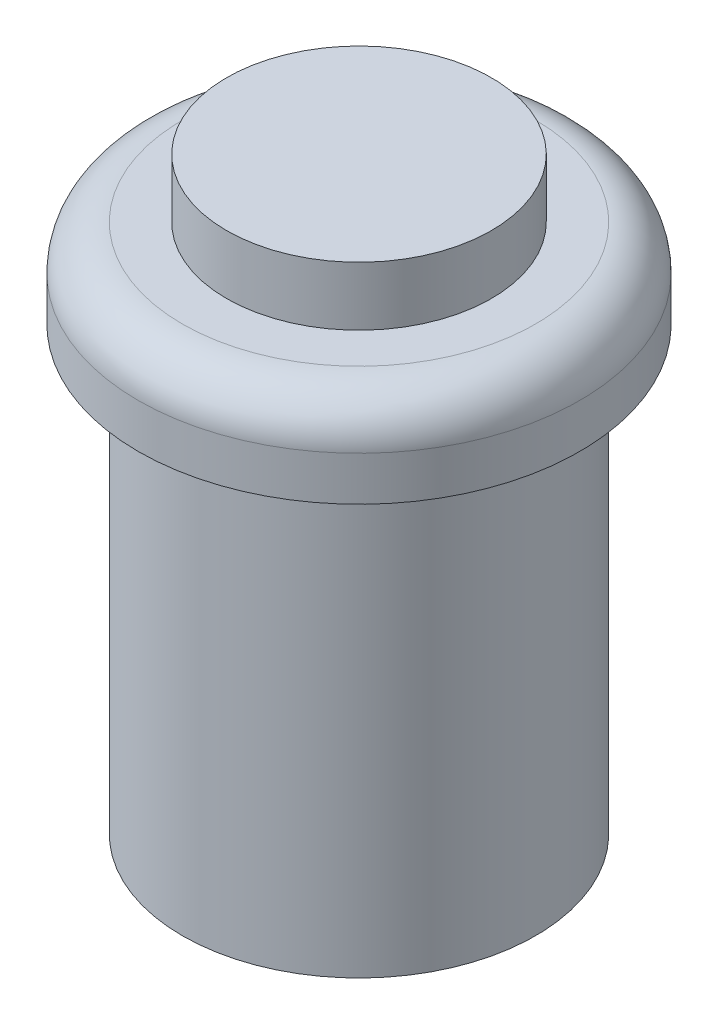
ISO-10303-21;
HEADER;
FILE_DESCRIPTION(('STEP AP214'),'2;1');
FILE_NAME('part.step','',(''),(''),'','','');
FILE_SCHEMA(('AUTOMOTIVE_DESIGN { 1 0 10303 214 1 1 1 1 }'));
ENDSEC;
DATA;
#1=APPLICATION_CONTEXT('core data for automotive mechanical design processes');
#2=APPLICATION_PROTOCOL_DEFINITION('international standard','automotive_design',2000,#1);
#3=PRODUCT_CONTEXT('',#1,'mechanical');
#4=PRODUCT('Part','Part','',(#3));
#5=PRODUCT_RELATED_PRODUCT_CATEGORY('part','',(#4));
#6=PRODUCT_DEFINITION_FORMATION('','',#4);
#7=PRODUCT_DEFINITION_CONTEXT('part definition',#1,'design');
#8=PRODUCT_DEFINITION('design','',#6,#7);
#9=PRODUCT_DEFINITION_SHAPE('','',#8);
#10=(LENGTH_UNIT() NAMED_UNIT(*) SI_UNIT(.MILLI.,.METRE.));
#11=(NAMED_UNIT(*) PLANE_ANGLE_UNIT() SI_UNIT($,.RADIAN.));
#12=(NAMED_UNIT(*) SI_UNIT($,.STERADIAN.) SOLID_ANGLE_UNIT());
#13=UNCERTAINTY_MEASURE_WITH_UNIT(LENGTH_MEASURE(1.E-05),#10,'distance_accuracy_value','');
#14=(GEOMETRIC_REPRESENTATION_CONTEXT(3) GLOBAL_UNCERTAINTY_ASSIGNED_CONTEXT((#13)) GLOBAL_UNIT_ASSIGNED_CONTEXT((#10,
#11,#12)) REPRESENTATION_CONTEXT('',''));
#15=CARTESIAN_POINT('',(0.,0.,0.));
#16=DIRECTION('',(0.,0.,1.));
#17=DIRECTION('',(1.,0.,0.));
#18=AXIS2_PLACEMENT_3D('',#15,#16,#17);
#19=CARTESIAN_POINT('',(0.,15.,0.));
#20=DIRECTION('',(0.,-1.,0.));
#21=DIRECTION('',(0.,0.,-1.));
#22=AXIS2_PLACEMENT_3D('',#19,#20,#21);
#23=CYLINDRICAL_SURFACE('',#22,6.);
#24=CARTESIAN_POINT('',(0.,15.,0.));
#25=DIRECTION('',(0.,1.,0.));
#26=DIRECTION('',(0.,0.,1.));
#27=AXIS2_PLACEMENT_3D('',#24,#25,#26);
#28=CIRCLE('',#27,6.);
#29=CARTESIAN_POINT('',(0.,15.,6.));
#30=VERTEX_POINT('',#29);
#31=EDGE_CURVE('E61',#30,#30,#28,.T.);
#32=ORIENTED_EDGE('',*,*,#31,.F.);
#33=EDGE_LOOP('',(#32));
#34=FACE_BOUND('',#33,.T.);
#35=CARTESIAN_POINT('',(0.,0.,0.));
#36=DIRECTION('',(0.,1.,0.));
#37=DIRECTION('',(0.,0.,1.));
#38=AXIS2_PLACEMENT_3D('',#35,#36,#37);
#39=CIRCLE('',#38,6.);
#40=CARTESIAN_POINT('',(0.,0.,6.));
#41=VERTEX_POINT('',#40);
#42=EDGE_CURVE('E64',#41,#41,#39,.T.);
#43=ORIENTED_EDGE('',*,*,#42,.T.);
#44=EDGE_LOOP('',(#43));
#45=FACE_BOUND('',#44,.T.);
#46=ADVANCED_FACE('F43',(#34,#45),#23,.T.);
#47=CARTESIAN_POINT('',(0.,0.,0.));
#48=DIRECTION('',(0.,1.,0.));
#49=DIRECTION('',(0.,0.,1.));
#50=AXIS2_PLACEMENT_3D('',#47,#48,#49);
#51=PLANE('',#50);
#52=ORIENTED_EDGE('',*,*,#42,.F.);
#53=EDGE_LOOP('',(#52));
#54=FACE_BOUND('',#53,.T.);
#55=ADVANCED_FACE('F99',(#54),#51,.F.);
#56=CARTESIAN_POINT('',(0.,18.,0.));
#57=DIRECTION('',(0.,-1.,0.));
#58=DIRECTION('',(0.,0.,-1.));
#59=AXIS2_PLACEMENT_3D('',#56,#57,#58);
#60=CYLINDRICAL_SURFACE('',#59,7.5);
#61=CARTESIAN_POINT('',(0.,16.5,0.));
#62=DIRECTION('',(0.,1.,0.));
#63=DIRECTION('',(0.,0.,1.));
#64=AXIS2_PLACEMENT_3D('',#61,#62,#63);
#65=CIRCLE('',#64,7.5);
#66=CARTESIAN_POINT('',(0.,16.5,7.5));
#67=VERTEX_POINT('',#66);
#68=EDGE_CURVE('E10',#67,#67,#65,.F.);
#69=ORIENTED_EDGE('',*,*,#68,.T.);
#70=EDGE_LOOP('',(#69));
#71=FACE_BOUND('',#70,.T.);
#72=CARTESIAN_POINT('',(0.,15.,0.));
#73=DIRECTION('',(0.,1.,0.));
#74=DIRECTION('',(0.,0.,1.));
#75=AXIS2_PLACEMENT_3D('',#72,#73,#74);
#76=CIRCLE('',#75,7.5);
#77=CARTESIAN_POINT('',(0.,15.,7.5));
#78=VERTEX_POINT('',#77);
#79=EDGE_CURVE('E68',#78,#78,#76,.T.);
#80=ORIENTED_EDGE('',*,*,#79,.T.);
#81=EDGE_LOOP('',(#80));
#82=FACE_BOUND('',#81,.T.);
#83=ADVANCED_FACE('F91',(#71,#82),#60,.T.);
#84=CARTESIAN_POINT('',(0.,18.,0.));
#85=DIRECTION('',(0.,1.,0.));
#86=DIRECTION('',(0.,0.,1.));
#87=AXIS2_PLACEMENT_3D('',#84,#85,#86);
#88=PLANE('',#87);
#89=CARTESIAN_POINT('',(0.,18.,0.));
#90=DIRECTION('',(0.,1.,0.));
#91=DIRECTION('',(0.,0.,1.));
#92=AXIS2_PLACEMENT_3D('',#89,#90,#91);
#93=CIRCLE('',#92,6.);
#94=CARTESIAN_POINT('',(0.,18.,6.));
#95=VERTEX_POINT('',#94);
#96=EDGE_CURVE('E51',#95,#95,#93,.T.);
#97=ORIENTED_EDGE('',*,*,#96,.T.);
#98=EDGE_LOOP('',(#97));
#99=FACE_BOUND('',#98,.T.);
#100=CARTESIAN_POINT('',(0.,18.,0.));
#101=DIRECTION('',(0.,1.,0.));
#102=DIRECTION('',(0.,0.,1.));
#103=AXIS2_PLACEMENT_3D('',#100,#101,#102);
#104=CIRCLE('',#103,4.5);
#105=CARTESIAN_POINT('',(0.,18.,4.5));
#106=VERTEX_POINT('',#105);
#107=EDGE_CURVE('E56',#106,#106,#104,.T.);
#108=ORIENTED_EDGE('',*,*,#107,.F.);
#109=EDGE_LOOP('',(#108));
#110=FACE_BOUND('',#109,.T.);
#111=ADVANCED_FACE('F89',(#99,#110),#88,.T.);
#112=CARTESIAN_POINT('',(0.,15.,0.));
#113=DIRECTION('',(0.,1.,0.));
#114=DIRECTION('',(0.,0.,1.));
#115=AXIS2_PLACEMENT_3D('',#112,#113,#114);
#116=PLANE('',#115);
#117=ORIENTED_EDGE('',*,*,#31,.T.);
#118=EDGE_LOOP('',(#117));
#119=FACE_BOUND('',#118,.T.);
#120=ORIENTED_EDGE('',*,*,#79,.F.);
#121=EDGE_LOOP('',(#120));
#122=FACE_BOUND('',#121,.T.);
#123=ADVANCED_FACE('F85',(#119,#122),#116,.F.);
#124=CARTESIAN_POINT('',(0.,20.,0.));
#125=DIRECTION('',(0.,-1.,0.));
#126=DIRECTION('',(0.,0.,-1.));
#127=AXIS2_PLACEMENT_3D('',#124,#125,#126);
#128=CYLINDRICAL_SURFACE('',#127,4.5);
#129=CARTESIAN_POINT('',(0.,20.,0.));
#130=DIRECTION('',(0.,1.,0.));
#131=DIRECTION('',(0.,0.,1.));
#132=AXIS2_PLACEMENT_3D('',#129,#130,#131);
#133=CIRCLE('',#132,4.5);
#134=CARTESIAN_POINT('',(0.,20.,4.5));
#135=VERTEX_POINT('',#134);
#136=EDGE_CURVE('E74',#135,#135,#133,.T.);
#137=ORIENTED_EDGE('',*,*,#136,.F.);
#138=EDGE_LOOP('',(#137));
#139=FACE_BOUND('',#138,.T.);
#140=ORIENTED_EDGE('',*,*,#107,.T.);
#141=EDGE_LOOP('',(#140));
#142=FACE_BOUND('',#141,.T.);
#143=ADVANCED_FACE('F82',(#139,#142),#128,.T.);
#144=CARTESIAN_POINT('',(0.,20.,0.));
#145=DIRECTION('',(0.,1.,0.));
#146=DIRECTION('',(0.,0.,1.));
#147=AXIS2_PLACEMENT_3D('',#144,#145,#146);
#148=PLANE('',#147);
#149=ORIENTED_EDGE('',*,*,#136,.T.);
#150=EDGE_LOOP('',(#149));
#151=FACE_BOUND('',#150,.T.);
#152=ADVANCED_FACE('F80',(#151),#148,.T.);
#153=CARTESIAN_POINT('',(0.,16.5,0.));
#154=DIRECTION('',(0.,1.,0.));
#155=DIRECTION('',(0.,0.,1.));
#156=AXIS2_PLACEMENT_3D('',#153,#154,#155);
#157=TOROIDAL_SURFACE('',#156,6.,1.5);
#158=ORIENTED_EDGE('',*,*,#68,.F.);
#159=EDGE_LOOP('',(#158));
#160=FACE_BOUND('',#159,.T.);
#161=ORIENTED_EDGE('',*,*,#96,.F.);
#162=EDGE_LOOP('',(#161));
#163=FACE_BOUND('',#162,.T.);
#164=ADVANCED_FACE('F45',(#160,#163),#157,.T.);
#165=CLOSED_SHELL('',(#46,#55,#83,#111,#123,#143,#152,#164));
#166=MANIFOLD_SOLID_BREP('B2',#165);
#167=ADVANCED_BREP_SHAPE_REPRESENTATION('',(#18,#166),#14);
#168=SHAPE_DEFINITION_REPRESENTATION(#9,#167);
ENDSEC;
END-ISO-10303-21;
